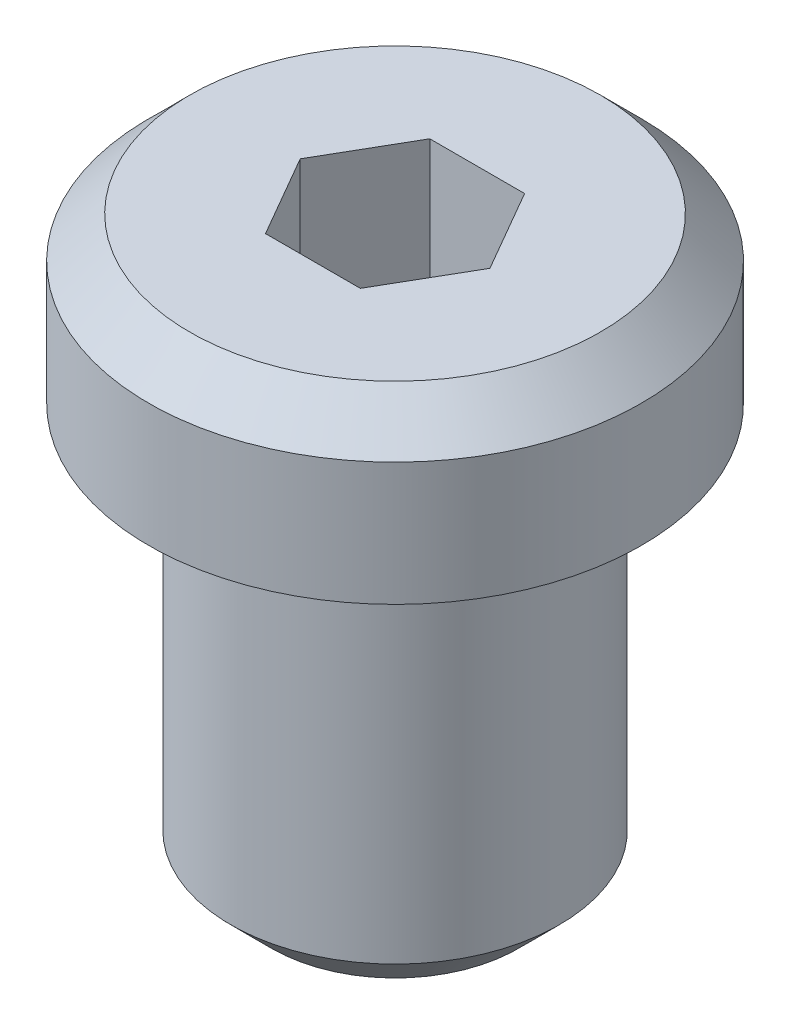
ISO-10303-21;
HEADER;
FILE_DESCRIPTION(('STEP AP214'),'2;1');
FILE_NAME('part.step','',(''),(''),'','','');
FILE_SCHEMA(('AUTOMOTIVE_DESIGN { 1 0 10303 214 1 1 1 1 }'));
ENDSEC;
DATA;
#1=APPLICATION_CONTEXT('core data for automotive mechanical design processes');
#2=APPLICATION_PROTOCOL_DEFINITION('international standard','automotive_design',2000,#1);
#3=PRODUCT_CONTEXT('',#1,'mechanical');
#4=PRODUCT('Part','Part','',(#3));
#5=PRODUCT_RELATED_PRODUCT_CATEGORY('part','',(#4));
#6=PRODUCT_DEFINITION_FORMATION('','',#4);
#7=PRODUCT_DEFINITION_CONTEXT('part definition',#1,'design');
#8=PRODUCT_DEFINITION('design','',#6,#7);
#9=PRODUCT_DEFINITION_SHAPE('','',#8);
#10=(LENGTH_UNIT() NAMED_UNIT(*) SI_UNIT(.MILLI.,.METRE.));
#11=(NAMED_UNIT(*) PLANE_ANGLE_UNIT() SI_UNIT($,.RADIAN.));
#12=(NAMED_UNIT(*) SI_UNIT($,.STERADIAN.) SOLID_ANGLE_UNIT());
#13=UNCERTAINTY_MEASURE_WITH_UNIT(LENGTH_MEASURE(1.E-05),#10,'distance_accuracy_value','');
#14=(GEOMETRIC_REPRESENTATION_CONTEXT(3) GLOBAL_UNCERTAINTY_ASSIGNED_CONTEXT((#13)) GLOBAL_UNIT_ASSIGNED_CONTEXT((#10,
#11,#12)) REPRESENTATION_CONTEXT('',''));
#15=CARTESIAN_POINT('',(0.,0.,0.));
#16=DIRECTION('',(0.,0.,1.));
#17=DIRECTION('',(1.,0.,0.));
#18=AXIS2_PLACEMENT_3D('',#15,#16,#17);
#19=CARTESIAN_POINT('',(3.00000000000001,0.,0.));
#20=DIRECTION('',(0.,-1.,0.));
#21=DIRECTION('',(0.,0.,-1.));
#22=AXIS2_PLACEMENT_3D('',#19,#20,#21);
#23=PLANE('',#22);
#24=CARTESIAN_POINT('',(0.,0.,0.));
#25=DIRECTION('',(0.,-1.,0.));
#26=DIRECTION('',(0.,0.,-1.));
#27=AXIS2_PLACEMENT_3D('',#24,#25,#26);
#28=CIRCLE('',#27,3.00000000000001);
#29=CARTESIAN_POINT('',(0.,0.,-3.00000000000001));
#30=VERTEX_POINT('',#29);
#31=EDGE_CURVE('E134',#30,#30,#28,.T.);
#32=ORIENTED_EDGE('',*,*,#31,.T.);
#33=EDGE_LOOP('',(#32));
#34=FACE_BOUND('',#33,.T.);
#35=ADVANCED_FACE('F33',(#34),#23,.T.);
#36=CARTESIAN_POINT('',(0.,14.,0.));
#37=DIRECTION('',(0.,1.,0.));
#38=DIRECTION('',(0.,0.,1.));
#39=AXIS2_PLACEMENT_3D('',#36,#37,#38);
#40=PLANE('',#39);
#41=DIRECTION('',(-0.5,0.,-0.866025403784438));
#42=VECTOR('',#41,1.);
#43=CARTESIAN_POINT('',(2.3094010767585,14.,0.));
#44=LINE('',#43,#42);
#45=CARTESIAN_POINT('',(2.3094010767585,14.,0.));
#46=VERTEX_POINT('',#45);
#47=CARTESIAN_POINT('',(1.15470053837925,14.,-2.));
#48=VERTEX_POINT('',#47);
#49=EDGE_CURVE('E47',#46,#48,#44,.T.);
#50=ORIENTED_EDGE('',*,*,#49,.F.);
#51=DIRECTION('',(0.5,0.,-0.866025403784439));
#52=VECTOR('',#51,1.);
#53=CARTESIAN_POINT('',(1.15470053837925,14.,2.));
#54=LINE('',#53,#52);
#55=CARTESIAN_POINT('',(1.15470053837925,14.,2.));
#56=VERTEX_POINT('',#55);
#57=EDGE_CURVE('E130',#56,#46,#54,.T.);
#58=ORIENTED_EDGE('',*,*,#57,.F.);
#59=DIRECTION('',(1.,0.,0.));
#60=VECTOR('',#59,1.);
#61=CARTESIAN_POINT('',(-1.15470053837925,14.,2.));
#62=LINE('',#61,#60);
#63=CARTESIAN_POINT('',(-1.15470053837925,14.,2.));
#64=VERTEX_POINT('',#63);
#65=EDGE_CURVE('E128',#64,#56,#62,.T.);
#66=ORIENTED_EDGE('',*,*,#65,.F.);
#67=DIRECTION('',(0.5,0.,0.866025403784438));
#68=VECTOR('',#67,1.);
#69=CARTESIAN_POINT('',(-2.3094010767585,14.,0.));
#70=LINE('',#69,#68);
#71=CARTESIAN_POINT('',(-2.3094010767585,14.,0.));
#72=VERTEX_POINT('',#71);
#73=EDGE_CURVE('E95',#72,#64,#70,.T.);
#74=ORIENTED_EDGE('',*,*,#73,.F.);
#75=DIRECTION('',(-0.5,0.,0.866025403784439));
#76=VECTOR('',#75,1.);
#77=CARTESIAN_POINT('',(-1.15470053837925,14.,-2.));
#78=LINE('',#77,#76);
#79=CARTESIAN_POINT('',(-1.15470053837925,14.,-2.));
#80=VERTEX_POINT('',#79);
#81=EDGE_CURVE('E124',#80,#72,#78,.T.);
#82=ORIENTED_EDGE('',*,*,#81,.F.);
#83=DIRECTION('',(-1.,0.,0.));
#84=VECTOR('',#83,1.);
#85=CARTESIAN_POINT('',(1.15470053837925,14.,-2.));
#86=LINE('',#85,#84);
#87=EDGE_CURVE('E121',#48,#80,#86,.T.);
#88=ORIENTED_EDGE('',*,*,#87,.F.);
#89=EDGE_LOOP('',(#50,#58,#66,#74,#82,#88));
#90=FACE_BOUND('',#89,.T.);
#91=CARTESIAN_POINT('',(0.,14.,0.));
#92=DIRECTION('',(0.,-1.,0.));
#93=DIRECTION('',(0.,0.,-1.));
#94=AXIS2_PLACEMENT_3D('',#91,#92,#93);
#95=CIRCLE('',#94,5.);
#96=CARTESIAN_POINT('',(0.,14.,-5.));
#97=VERTEX_POINT('',#96);
#98=EDGE_CURVE('E11',#97,#97,#95,.T.);
#99=ORIENTED_EDGE('',*,*,#98,.F.);
#100=EDGE_LOOP('',(#99));
#101=FACE_BOUND('',#100,.T.);
#102=ADVANCED_FACE('F158',(#90,#101),#40,.T.);
#103=CARTESIAN_POINT('',(0.,13.,0.));
#104=DIRECTION('',(0.,-1.,0.));
#105=DIRECTION('',(0.,0.,-1.));
#106=AXIS2_PLACEMENT_3D('',#103,#104,#105);
#107=CONICAL_SURFACE('',#106,6.,0.785398163397451);
#108=ORIENTED_EDGE('',*,*,#98,.T.);
#109=EDGE_LOOP('',(#108));
#110=FACE_BOUND('',#109,.T.);
#111=CARTESIAN_POINT('',(0.,13.,0.));
#112=DIRECTION('',(0.,-1.,0.));
#113=DIRECTION('',(0.,0.,-1.));
#114=AXIS2_PLACEMENT_3D('',#111,#112,#113);
#115=CIRCLE('',#114,6.);
#116=CARTESIAN_POINT('',(0.,13.,-6.));
#117=VERTEX_POINT('',#116);
#118=EDGE_CURVE('E40',#117,#117,#115,.T.);
#119=ORIENTED_EDGE('',*,*,#118,.F.);
#120=EDGE_LOOP('',(#119));
#121=FACE_BOUND('',#120,.T.);
#122=ADVANCED_FACE('F156',(#110,#121),#107,.T.);
#123=CARTESIAN_POINT('',(0.,0.,0.));
#124=DIRECTION('',(0.,-1.,0.));
#125=DIRECTION('',(0.,0.,-1.));
#126=AXIS2_PLACEMENT_3D('',#123,#124,#125);
#127=CYLINDRICAL_SURFACE('',#126,6.);
#128=ORIENTED_EDGE('',*,*,#118,.T.);
#129=EDGE_LOOP('',(#128));
#130=FACE_BOUND('',#129,.T.);
#131=CARTESIAN_POINT('',(0.,10.,0.));
#132=DIRECTION('',(0.,-1.,0.));
#133=DIRECTION('',(0.,0.,-1.));
#134=AXIS2_PLACEMENT_3D('',#131,#132,#133);
#135=CIRCLE('',#134,6.);
#136=CARTESIAN_POINT('',(0.,10.,-6.));
#137=VERTEX_POINT('',#136);
#138=EDGE_CURVE('E148',#137,#137,#135,.T.);
#139=ORIENTED_EDGE('',*,*,#138,.F.);
#140=EDGE_LOOP('',(#139));
#141=FACE_BOUND('',#140,.T.);
#142=ADVANCED_FACE('F153',(#130,#141),#127,.T.);
#143=CARTESIAN_POINT('',(6.,10.,0.));
#144=DIRECTION('',(0.,-1.,0.));
#145=DIRECTION('',(0.,0.,-1.));
#146=AXIS2_PLACEMENT_3D('',#143,#144,#145);
#147=PLANE('',#146);
#148=ORIENTED_EDGE('',*,*,#138,.T.);
#149=EDGE_LOOP('',(#148));
#150=FACE_BOUND('',#149,.T.);
#151=CARTESIAN_POINT('',(0.,10.,0.));
#152=DIRECTION('',(0.,-1.,0.));
#153=DIRECTION('',(0.,0.,-1.));
#154=AXIS2_PLACEMENT_3D('',#151,#152,#153);
#155=CIRCLE('',#154,4.);
#156=CARTESIAN_POINT('',(0.,10.,-4.));
#157=VERTEX_POINT('',#156);
#158=EDGE_CURVE('E145',#157,#157,#155,.T.);
#159=ORIENTED_EDGE('',*,*,#158,.F.);
#160=EDGE_LOOP('',(#159));
#161=FACE_BOUND('',#160,.T.);
#162=ADVANCED_FACE('F165',(#150,#161),#147,.T.);
#163=CARTESIAN_POINT('',(0.,0.,0.));
#164=DIRECTION('',(0.,-1.,0.));
#165=DIRECTION('',(0.,0.,-1.));
#166=AXIS2_PLACEMENT_3D('',#163,#164,#165);
#167=CYLINDRICAL_SURFACE('',#166,4.);
#168=ORIENTED_EDGE('',*,*,#158,.T.);
#169=EDGE_LOOP('',(#168));
#170=FACE_BOUND('',#169,.T.);
#171=CARTESIAN_POINT('',(0.,1.,0.));
#172=DIRECTION('',(0.,-1.,0.));
#173=DIRECTION('',(0.,0.,-1.));
#174=AXIS2_PLACEMENT_3D('',#171,#172,#173);
#175=CIRCLE('',#174,4.);
#176=CARTESIAN_POINT('',(0.,1.,-4.));
#177=VERTEX_POINT('',#176);
#178=EDGE_CURVE('E142',#177,#177,#175,.T.);
#179=ORIENTED_EDGE('',*,*,#178,.F.);
#180=EDGE_LOOP('',(#179));
#181=FACE_BOUND('',#180,.T.);
#182=ADVANCED_FACE('F177',(#170,#181),#167,.T.);
#183=CARTESIAN_POINT('',(0.,0.,0.));
#184=DIRECTION('',(0.,1.,0.));
#185=DIRECTION('',(0.,0.,1.));
#186=AXIS2_PLACEMENT_3D('',#183,#184,#185);
#187=CONICAL_SURFACE('',#186,3.00000000000001,0.785398163397446);
#188=ORIENTED_EDGE('',*,*,#178,.T.);
#189=EDGE_LOOP('',(#188));
#190=FACE_BOUND('',#189,.T.);
#191=ORIENTED_EDGE('',*,*,#31,.F.);
#192=EDGE_LOOP('',(#191));
#193=FACE_BOUND('',#192,.T.);
#194=ADVANCED_FACE('F174',(#190,#193),#187,.T.);
#195=CARTESIAN_POINT('',(2.3094010767585,10.,0.));
#196=DIRECTION('',(0.866025403784438,0.,-0.5));
#197=DIRECTION('',(-0.5,0.,-0.866025403784439));
#198=AXIS2_PLACEMENT_3D('',#195,#196,#197);
#199=PLANE('',#198);
#200=ORIENTED_EDGE('',*,*,#49,.T.);
#201=DIRECTION('',(0.,1.,0.));
#202=VECTOR('',#201,1.);
#203=CARTESIAN_POINT('',(1.15470053837925,10.,-2.));
#204=LINE('',#203,#202);
#205=CARTESIAN_POINT('',(1.15470053837925,10.,-2.));
#206=VERTEX_POINT('',#205);
#207=EDGE_CURVE('E77',#206,#48,#204,.T.);
#208=ORIENTED_EDGE('',*,*,#207,.F.);
#209=DIRECTION('',(-0.5,0.,-0.866025403784438));
#210=VECTOR('',#209,1.);
#211=CARTESIAN_POINT('',(2.3094010767585,10.,0.));
#212=LINE('',#211,#210);
#213=CARTESIAN_POINT('',(2.3094010767585,10.,0.));
#214=VERTEX_POINT('',#213);
#215=EDGE_CURVE('E132',#214,#206,#212,.T.);
#216=ORIENTED_EDGE('',*,*,#215,.F.);
#217=DIRECTION('',(0.,1.,0.));
#218=VECTOR('',#217,1.);
#219=CARTESIAN_POINT('',(2.3094010767585,10.,0.));
#220=LINE('',#219,#218);
#221=EDGE_CURVE('E55',#214,#46,#220,.T.);
#222=ORIENTED_EDGE('',*,*,#221,.T.);
#223=EDGE_LOOP('',(#200,#208,#216,#222));
#224=FACE_BOUND('',#223,.T.);
#225=ADVANCED_FACE('F176',(#224),#199,.F.);
#226=CARTESIAN_POINT('',(1.15470053837925,10.,2.));
#227=DIRECTION('',(0.866025403784439,0.,0.5));
#228=DIRECTION('',(0.5,0.,-0.866025403784439));
#229=AXIS2_PLACEMENT_3D('',#226,#227,#228);
#230=PLANE('',#229);
#231=ORIENTED_EDGE('',*,*,#57,.T.);
#232=ORIENTED_EDGE('',*,*,#221,.F.);
#233=DIRECTION('',(0.5,0.,-0.866025403784439));
#234=VECTOR('',#233,1.);
#235=CARTESIAN_POINT('',(1.15470053837925,10.,2.));
#236=LINE('',#235,#234);
#237=CARTESIAN_POINT('',(1.15470053837925,10.,2.));
#238=VERTEX_POINT('',#237);
#239=EDGE_CURVE('E107',#238,#214,#236,.T.);
#240=ORIENTED_EDGE('',*,*,#239,.F.);
#241=DIRECTION('',(0.,1.,0.));
#242=VECTOR('',#241,1.);
#243=CARTESIAN_POINT('',(1.15470053837925,10.,2.));
#244=LINE('',#243,#242);
#245=EDGE_CURVE('E99',#238,#56,#244,.T.);
#246=ORIENTED_EDGE('',*,*,#245,.T.);
#247=EDGE_LOOP('',(#231,#232,#240,#246));
#248=FACE_BOUND('',#247,.T.);
#249=ADVANCED_FACE('F184',(#248),#230,.F.);
#250=CARTESIAN_POINT('',(-1.15470053837925,10.,2.));
#251=DIRECTION('',(0.,0.,1.));
#252=DIRECTION('',(1.,0.,0.));
#253=AXIS2_PLACEMENT_3D('',#250,#251,#252);
#254=PLANE('',#253);
#255=ORIENTED_EDGE('',*,*,#65,.T.);
#256=ORIENTED_EDGE('',*,*,#245,.F.);
#257=DIRECTION('',(1.,0.,0.));
#258=VECTOR('',#257,1.);
#259=CARTESIAN_POINT('',(-1.15470053837925,10.,2.));
#260=LINE('',#259,#258);
#261=CARTESIAN_POINT('',(-1.15470053837925,10.,2.));
#262=VERTEX_POINT('',#261);
#263=EDGE_CURVE('E103',#262,#238,#260,.T.);
#264=ORIENTED_EDGE('',*,*,#263,.F.);
#265=DIRECTION('',(0.,1.,0.));
#266=VECTOR('',#265,1.);
#267=CARTESIAN_POINT('',(-1.15470053837925,10.,2.));
#268=LINE('',#267,#266);
#269=EDGE_CURVE('E88',#262,#64,#268,.T.);
#270=ORIENTED_EDGE('',*,*,#269,.T.);
#271=EDGE_LOOP('',(#255,#256,#264,#270));
#272=FACE_BOUND('',#271,.T.);
#273=ADVANCED_FACE('F104',(#272),#254,.F.);
#274=CARTESIAN_POINT('',(-2.3094010767585,10.,0.));
#275=DIRECTION('',(-0.866025403784438,0.,0.5));
#276=DIRECTION('',(0.5,0.,0.866025403784439));
#277=AXIS2_PLACEMENT_3D('',#274,#275,#276);
#278=PLANE('',#277);
#279=ORIENTED_EDGE('',*,*,#73,.T.);
#280=ORIENTED_EDGE('',*,*,#269,.F.);
#281=DIRECTION('',(0.5,0.,0.866025403784438));
#282=VECTOR('',#281,1.);
#283=CARTESIAN_POINT('',(-2.3094010767585,10.,0.));
#284=LINE('',#283,#282);
#285=CARTESIAN_POINT('',(-2.3094010767585,10.,0.));
#286=VERTEX_POINT('',#285);
#287=EDGE_CURVE('E92',#286,#262,#284,.T.);
#288=ORIENTED_EDGE('',*,*,#287,.F.);
#289=DIRECTION('',(0.,1.,0.));
#290=VECTOR('',#289,1.);
#291=CARTESIAN_POINT('',(-2.3094010767585,10.,0.));
#292=LINE('',#291,#290);
#293=EDGE_CURVE('E100',#286,#72,#292,.T.);
#294=ORIENTED_EDGE('',*,*,#293,.T.);
#295=EDGE_LOOP('',(#279,#280,#288,#294));
#296=FACE_BOUND('',#295,.T.);
#297=ADVANCED_FACE('F90',(#296),#278,.F.);
#298=CARTESIAN_POINT('',(-1.15470053837925,10.,-2.));
#299=DIRECTION('',(-0.866025403784439,0.,-0.5));
#300=DIRECTION('',(-0.5,0.,0.866025403784439));
#301=AXIS2_PLACEMENT_3D('',#298,#299,#300);
#302=PLANE('',#301);
#303=ORIENTED_EDGE('',*,*,#81,.T.);
#304=ORIENTED_EDGE('',*,*,#293,.F.);
#305=DIRECTION('',(-0.5,0.,0.866025403784439));
#306=VECTOR('',#305,1.);
#307=CARTESIAN_POINT('',(-1.15470053837925,10.,-2.));
#308=LINE('',#307,#306);
#309=CARTESIAN_POINT('',(-1.15470053837925,10.,-2.));
#310=VERTEX_POINT('',#309);
#311=EDGE_CURVE('E113',#310,#286,#308,.T.);
#312=ORIENTED_EDGE('',*,*,#311,.F.);
#313=DIRECTION('',(0.,1.,0.));
#314=VECTOR('',#313,1.);
#315=CARTESIAN_POINT('',(-1.15470053837925,10.,-2.));
#316=LINE('',#315,#314);
#317=EDGE_CURVE('E137',#310,#80,#316,.T.);
#318=ORIENTED_EDGE('',*,*,#317,.T.);
#319=EDGE_LOOP('',(#303,#304,#312,#318));
#320=FACE_BOUND('',#319,.T.);
#321=ADVANCED_FACE('F248',(#320),#302,.F.);
#322=CARTESIAN_POINT('',(1.15470053837925,10.,-2.));
#323=DIRECTION('',(0.,0.,-1.));
#324=DIRECTION('',(-1.,0.,0.));
#325=AXIS2_PLACEMENT_3D('',#322,#323,#324);
#326=PLANE('',#325);
#327=ORIENTED_EDGE('',*,*,#87,.T.);
#328=ORIENTED_EDGE('',*,*,#317,.F.);
#329=DIRECTION('',(-1.,0.,0.));
#330=VECTOR('',#329,1.);
#331=CARTESIAN_POINT('',(1.15470053837925,10.,-2.));
#332=LINE('',#331,#330);
#333=EDGE_CURVE('E115',#206,#310,#332,.T.);
#334=ORIENTED_EDGE('',*,*,#333,.F.);
#335=ORIENTED_EDGE('',*,*,#207,.T.);
#336=EDGE_LOOP('',(#327,#328,#334,#335));
#337=FACE_BOUND('',#336,.T.);
#338=ADVANCED_FACE('F257',(#337),#326,.F.);
#339=CARTESIAN_POINT('',(0.,10.,0.));
#340=DIRECTION('',(0.,1.,0.));
#341=DIRECTION('',(0.,0.,1.));
#342=AXIS2_PLACEMENT_3D('',#339,#340,#341);
#343=PLANE('',#342);
#344=ORIENTED_EDGE('',*,*,#215,.T.);
#345=ORIENTED_EDGE('',*,*,#333,.T.);
#346=ORIENTED_EDGE('',*,*,#311,.T.);
#347=ORIENTED_EDGE('',*,*,#287,.T.);
#348=ORIENTED_EDGE('',*,*,#263,.T.);
#349=ORIENTED_EDGE('',*,*,#239,.T.);
#350=EDGE_LOOP('',(#344,#345,#346,#347,#348,#349));
#351=FACE_BOUND('',#350,.T.);
#352=ADVANCED_FACE('F110',(#351),#343,.T.);
#353=CLOSED_SHELL('',(#35,#102,#122,#142,#162,#182,#194,#225,#249,#273,#297,#321,#338,#352));
#354=MANIFOLD_SOLID_BREP('B2',#353);
#355=ADVANCED_BREP_SHAPE_REPRESENTATION('',(#18,#354),#14);
#356=SHAPE_DEFINITION_REPRESENTATION(#9,#355);
ENDSEC;
END-ISO-10303-21;
